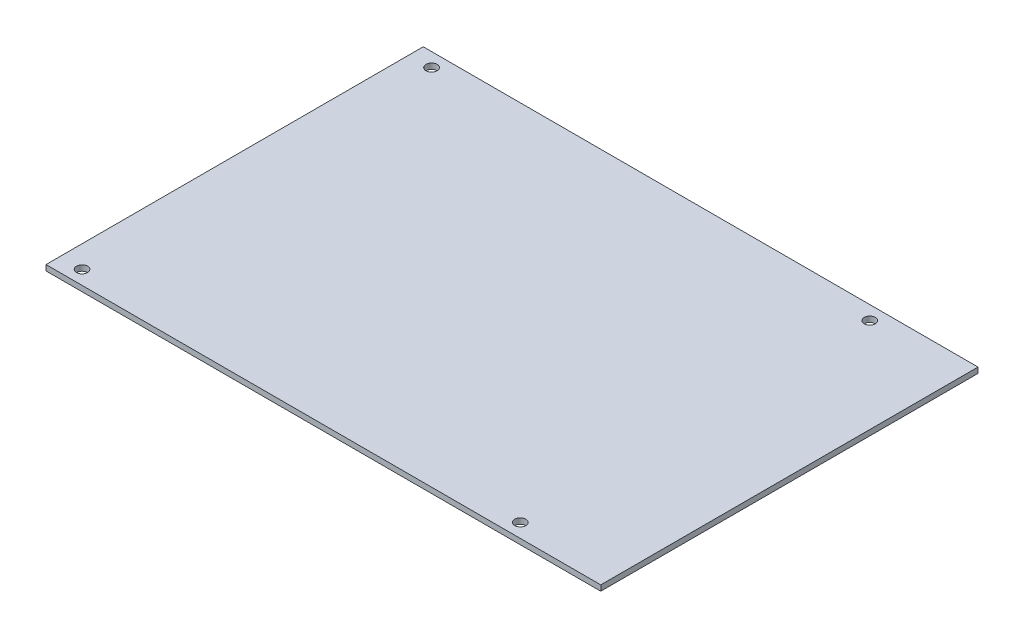
ISO-10303-21;
HEADER;
FILE_DESCRIPTION(('STEP AP214'),'2;1');
FILE_NAME('part.step','',(''),(''),'','','');
FILE_SCHEMA(('AUTOMOTIVE_DESIGN { 1 0 10303 214 1 1 1 1 }'));
ENDSEC;
DATA;
#1=APPLICATION_CONTEXT('core data for automotive mechanical design processes');
#2=APPLICATION_PROTOCOL_DEFINITION('international standard','automotive_design',2000,#1);
#3=PRODUCT_CONTEXT('',#1,'mechanical');
#4=PRODUCT('Part','Part','',(#3));
#5=PRODUCT_RELATED_PRODUCT_CATEGORY('part','',(#4));
#6=PRODUCT_DEFINITION_FORMATION('','',#4);
#7=PRODUCT_DEFINITION_CONTEXT('part definition',#1,'design');
#8=PRODUCT_DEFINITION('design','',#6,#7);
#9=PRODUCT_DEFINITION_SHAPE('','',#8);
#10=(LENGTH_UNIT() NAMED_UNIT(*) SI_UNIT(.MILLI.,.METRE.));
#11=(NAMED_UNIT(*) PLANE_ANGLE_UNIT() SI_UNIT($,.RADIAN.));
#12=(NAMED_UNIT(*) SI_UNIT($,.STERADIAN.) SOLID_ANGLE_UNIT());
#13=UNCERTAINTY_MEASURE_WITH_UNIT(LENGTH_MEASURE(1.E-05),#10,'distance_accuracy_value','');
#14=(GEOMETRIC_REPRESENTATION_CONTEXT(3) GLOBAL_UNCERTAINTY_ASSIGNED_CONTEXT((#13)) GLOBAL_UNIT_ASSIGNED_CONTEXT((#10,
#11,#12)) REPRESENTATION_CONTEXT('',''));
#15=CARTESIAN_POINT('',(0.,0.,0.));
#16=DIRECTION('',(0.,0.,1.));
#17=DIRECTION('',(1.,0.,0.));
#18=AXIS2_PLACEMENT_3D('',#15,#16,#17);
#19=CARTESIAN_POINT('',(-50.,1.,34.));
#20=DIRECTION('',(1.,0.,0.));
#21=DIRECTION('',(0.,0.,-1.));
#22=AXIS2_PLACEMENT_3D('',#19,#20,#21);
#23=PLANE('',#22);
#24=DIRECTION('',(0.,0.,1.));
#25=VECTOR('',#24,1.);
#26=CARTESIAN_POINT('',(-50.,0.,34.));
#27=LINE('',#26,#25);
#28=CARTESIAN_POINT('',(-50.,0.,-34.));
#29=VERTEX_POINT('',#28);
#30=CARTESIAN_POINT('',(-50.,0.,34.));
#31=VERTEX_POINT('',#30);
#32=EDGE_CURVE('E101',#29,#31,#27,.T.);
#33=ORIENTED_EDGE('',*,*,#32,.T.);
#34=DIRECTION('',(0.,-1.,0.));
#35=VECTOR('',#34,1.);
#36=CARTESIAN_POINT('',(-50.,1.,34.));
#37=LINE('',#36,#35);
#38=CARTESIAN_POINT('',(-50.,1.,34.));
#39=VERTEX_POINT('',#38);
#40=EDGE_CURVE('E11',#39,#31,#37,.T.);
#41=ORIENTED_EDGE('',*,*,#40,.F.);
#42=DIRECTION('',(0.,0.,1.));
#43=VECTOR('',#42,1.);
#44=CARTESIAN_POINT('',(-50.,1.,34.));
#45=LINE('',#44,#43);
#46=CARTESIAN_POINT('',(-50.,1.,-34.));
#47=VERTEX_POINT('',#46);
#48=EDGE_CURVE('E88',#47,#39,#45,.T.);
#49=ORIENTED_EDGE('',*,*,#48,.F.);
#50=DIRECTION('',(0.,-1.,0.));
#51=VECTOR('',#50,1.);
#52=CARTESIAN_POINT('',(-50.,1.,-34.));
#53=LINE('',#52,#51);
#54=EDGE_CURVE('E97',#47,#29,#53,.T.);
#55=ORIENTED_EDGE('',*,*,#54,.T.);
#56=EDGE_LOOP('',(#33,#41,#49,#55));
#57=FACE_BOUND('',#56,.T.);
#58=ADVANCED_FACE('F35',(#57),#23,.F.);
#59=CARTESIAN_POINT('',(50.,1.,34.));
#60=DIRECTION('',(0.,0.,-1.));
#61=DIRECTION('',(-1.,0.,0.));
#62=AXIS2_PLACEMENT_3D('',#59,#60,#61);
#63=PLANE('',#62);
#64=DIRECTION('',(1.,0.,0.));
#65=VECTOR('',#64,1.);
#66=CARTESIAN_POINT('',(50.,0.,34.));
#67=LINE('',#66,#65);
#68=CARTESIAN_POINT('',(50.,0.,34.));
#69=VERTEX_POINT('',#68);
#70=EDGE_CURVE('E92',#31,#69,#67,.T.);
#71=ORIENTED_EDGE('',*,*,#70,.T.);
#72=DIRECTION('',(0.,-1.,0.));
#73=VECTOR('',#72,1.);
#74=CARTESIAN_POINT('',(50.,1.,34.));
#75=LINE('',#74,#73);
#76=CARTESIAN_POINT('',(50.,1.,34.));
#77=VERTEX_POINT('',#76);
#78=EDGE_CURVE('E44',#77,#69,#75,.T.);
#79=ORIENTED_EDGE('',*,*,#78,.F.);
#80=DIRECTION('',(1.,0.,0.));
#81=VECTOR('',#80,1.);
#82=CARTESIAN_POINT('',(50.,1.,34.));
#83=LINE('',#82,#81);
#84=EDGE_CURVE('E83',#39,#77,#83,.T.);
#85=ORIENTED_EDGE('',*,*,#84,.F.);
#86=ORIENTED_EDGE('',*,*,#40,.T.);
#87=EDGE_LOOP('',(#71,#79,#85,#86));
#88=FACE_BOUND('',#87,.T.);
#89=ADVANCED_FACE('F91',(#88),#63,.F.);
#90=CARTESIAN_POINT('',(50.,1.,34.));
#91=DIRECTION('',(-1.,0.,0.));
#92=DIRECTION('',(0.,0.,1.));
#93=AXIS2_PLACEMENT_3D('',#90,#91,#92);
#94=PLANE('',#93);
#95=DIRECTION('',(0.,0.,-1.));
#96=VECTOR('',#95,1.);
#97=CARTESIAN_POINT('',(50.,0.,34.));
#98=LINE('',#97,#96);
#99=CARTESIAN_POINT('',(50.,0.,-34.));
#100=VERTEX_POINT('',#99);
#101=EDGE_CURVE('E70',#69,#100,#98,.T.);
#102=ORIENTED_EDGE('',*,*,#101,.T.);
#103=DIRECTION('',(0.,-1.,0.));
#104=VECTOR('',#103,1.);
#105=CARTESIAN_POINT('',(50.,1.,-34.));
#106=LINE('',#105,#104);
#107=CARTESIAN_POINT('',(50.,1.,-34.));
#108=VERTEX_POINT('',#107);
#109=EDGE_CURVE('E93',#108,#100,#106,.T.);
#110=ORIENTED_EDGE('',*,*,#109,.F.);
#111=DIRECTION('',(0.,0.,-1.));
#112=VECTOR('',#111,1.);
#113=CARTESIAN_POINT('',(50.,1.,34.));
#114=LINE('',#113,#112);
#115=EDGE_CURVE('E86',#77,#108,#114,.T.);
#116=ORIENTED_EDGE('',*,*,#115,.F.);
#117=ORIENTED_EDGE('',*,*,#78,.T.);
#118=EDGE_LOOP('',(#102,#110,#116,#117));
#119=FACE_BOUND('',#118,.T.);
#120=ADVANCED_FACE('F95',(#119),#94,.F.);
#121=CARTESIAN_POINT('',(50.,1.,-34.));
#122=DIRECTION('',(0.,0.,1.));
#123=DIRECTION('',(1.,0.,0.));
#124=AXIS2_PLACEMENT_3D('',#121,#122,#123);
#125=PLANE('',#124);
#126=DIRECTION('',(-1.,0.,0.));
#127=VECTOR('',#126,1.);
#128=CARTESIAN_POINT('',(50.,0.,-34.));
#129=LINE('',#128,#127);
#130=EDGE_CURVE('E76',#100,#29,#129,.T.);
#131=ORIENTED_EDGE('',*,*,#130,.T.);
#132=ORIENTED_EDGE('',*,*,#54,.F.);
#133=DIRECTION('',(-1.,0.,0.));
#134=VECTOR('',#133,1.);
#135=CARTESIAN_POINT('',(50.,1.,-34.));
#136=LINE('',#135,#134);
#137=EDGE_CURVE('E53',#108,#47,#136,.T.);
#138=ORIENTED_EDGE('',*,*,#137,.F.);
#139=ORIENTED_EDGE('',*,*,#109,.T.);
#140=EDGE_LOOP('',(#131,#132,#138,#139));
#141=FACE_BOUND('',#140,.T.);
#142=ADVANCED_FACE('F139',(#141),#125,.F.);
#143=CARTESIAN_POINT('',(0.,1.,0.));
#144=DIRECTION('',(0.,1.,0.));
#145=DIRECTION('',(0.,0.,1.));
#146=AXIS2_PLACEMENT_3D('',#143,#144,#145);
#147=PLANE('',#146);
#148=CARTESIAN_POINT('',(-46.,1.,31.5));
#149=DIRECTION('',(0.,1.,0.));
#150=DIRECTION('',(0.,0.,-1.));
#151=AXIS2_PLACEMENT_3D('',#148,#149,#150);
#152=CIRCLE('',#151,0.999999999999998);
#153=CARTESIAN_POINT('',(-46.,1.,30.5));
#154=VERTEX_POINT('',#153);
#155=EDGE_CURVE('E128',#154,#154,#152,.T.);
#156=ORIENTED_EDGE('',*,*,#155,.F.);
#157=EDGE_LOOP('',(#156));
#158=FACE_BOUND('',#157,.T.);
#159=CARTESIAN_POINT('',(33.,1.,-31.5));
#160=DIRECTION('',(0.,1.,0.));
#161=DIRECTION('',(0.,0.,1.));
#162=AXIS2_PLACEMENT_3D('',#159,#160,#161);
#163=CIRCLE('',#162,0.999999999999998);
#164=CARTESIAN_POINT('',(33.,1.,-30.5));
#165=VERTEX_POINT('',#164);
#166=EDGE_CURVE('E118',#165,#165,#163,.T.);
#167=ORIENTED_EDGE('',*,*,#166,.F.);
#168=EDGE_LOOP('',(#167));
#169=FACE_BOUND('',#168,.T.);
#170=CARTESIAN_POINT('',(33.,1.,31.5));
#171=DIRECTION('',(0.,1.,0.));
#172=DIRECTION('',(0.,0.,-1.));
#173=AXIS2_PLACEMENT_3D('',#170,#171,#172);
#174=CIRCLE('',#173,0.999999999999998);
#175=CARTESIAN_POINT('',(33.,1.,30.5));
#176=VERTEX_POINT('',#175);
#177=EDGE_CURVE('E115',#176,#176,#174,.T.);
#178=ORIENTED_EDGE('',*,*,#177,.F.);
#179=EDGE_LOOP('',(#178));
#180=FACE_BOUND('',#179,.T.);
#181=CARTESIAN_POINT('',(-46.,1.,-31.5));
#182=DIRECTION('',(0.,1.,0.));
#183=DIRECTION('',(0.,0.,1.));
#184=AXIS2_PLACEMENT_3D('',#181,#182,#183);
#185=CIRCLE('',#184,0.999999999999998);
#186=CARTESIAN_POINT('',(-46.,1.,-30.5));
#187=VERTEX_POINT('',#186);
#188=EDGE_CURVE('E112',#187,#187,#185,.T.);
#189=ORIENTED_EDGE('',*,*,#188,.F.);
#190=EDGE_LOOP('',(#189));
#191=FACE_BOUND('',#190,.T.);
#192=ORIENTED_EDGE('',*,*,#48,.T.);
#193=ORIENTED_EDGE('',*,*,#84,.T.);
#194=ORIENTED_EDGE('',*,*,#115,.T.);
#195=ORIENTED_EDGE('',*,*,#137,.T.);
#196=EDGE_LOOP('',(#192,#193,#194,#195));
#197=FACE_BOUND('',#196,.T.);
#198=ADVANCED_FACE('F84',(#158,#169,#180,#191,#197),#147,.T.);
#199=CARTESIAN_POINT('',(0.,0.,0.));
#200=DIRECTION('',(0.,1.,0.));
#201=DIRECTION('',(0.,0.,1.));
#202=AXIS2_PLACEMENT_3D('',#199,#200,#201);
#203=PLANE('',#202);
#204=CARTESIAN_POINT('',(-46.,0.,31.5));
#205=DIRECTION('',(0.,1.,0.));
#206=DIRECTION('',(0.,0.,1.));
#207=AXIS2_PLACEMENT_3D('',#204,#205,#206);
#208=CIRCLE('',#207,0.999999999999998);
#209=CARTESIAN_POINT('',(-46.,0.,32.5));
#210=VERTEX_POINT('',#209);
#211=EDGE_CURVE('E38',#210,#210,#208,.T.);
#212=ORIENTED_EDGE('',*,*,#211,.T.);
#213=EDGE_LOOP('',(#212));
#214=FACE_BOUND('',#213,.T.);
#215=CARTESIAN_POINT('',(33.,0.,-31.5));
#216=DIRECTION('',(0.,1.,0.));
#217=DIRECTION('',(0.,0.,1.));
#218=AXIS2_PLACEMENT_3D('',#215,#216,#217);
#219=CIRCLE('',#218,0.999999999999998);
#220=CARTESIAN_POINT('',(33.,0.,-30.5));
#221=VERTEX_POINT('',#220);
#222=EDGE_CURVE('E116',#221,#221,#219,.T.);
#223=ORIENTED_EDGE('',*,*,#222,.T.);
#224=EDGE_LOOP('',(#223));
#225=FACE_BOUND('',#224,.T.);
#226=CARTESIAN_POINT('',(33.,0.,31.5));
#227=DIRECTION('',(0.,1.,0.));
#228=DIRECTION('',(0.,0.,1.));
#229=AXIS2_PLACEMENT_3D('',#226,#227,#228);
#230=CIRCLE('',#229,0.999999999999998);
#231=CARTESIAN_POINT('',(33.,0.,32.5));
#232=VERTEX_POINT('',#231);
#233=EDGE_CURVE('E113',#232,#232,#230,.T.);
#234=ORIENTED_EDGE('',*,*,#233,.T.);
#235=EDGE_LOOP('',(#234));
#236=FACE_BOUND('',#235,.T.);
#237=CARTESIAN_POINT('',(-46.,0.,-31.5));
#238=DIRECTION('',(0.,1.,0.));
#239=DIRECTION('',(0.,0.,1.));
#240=AXIS2_PLACEMENT_3D('',#237,#238,#239);
#241=CIRCLE('',#240,0.999999999999998);
#242=CARTESIAN_POINT('',(-46.,0.,-30.5));
#243=VERTEX_POINT('',#242);
#244=EDGE_CURVE('E104',#243,#243,#241,.T.);
#245=ORIENTED_EDGE('',*,*,#244,.T.);
#246=EDGE_LOOP('',(#245));
#247=FACE_BOUND('',#246,.T.);
#248=ORIENTED_EDGE('',*,*,#32,.F.);
#249=ORIENTED_EDGE('',*,*,#130,.F.);
#250=ORIENTED_EDGE('',*,*,#101,.F.);
#251=ORIENTED_EDGE('',*,*,#70,.F.);
#252=EDGE_LOOP('',(#248,#249,#250,#251));
#253=FACE_BOUND('',#252,.T.);
#254=ADVANCED_FACE('F138',(#214,#225,#236,#247,#253),#203,.F.);
#255=CARTESIAN_POINT('',(-46.,-9.,-31.5));
#256=DIRECTION('',(0.,1.,0.));
#257=DIRECTION('',(0.,0.,1.));
#258=AXIS2_PLACEMENT_3D('',#255,#256,#257);
#259=CYLINDRICAL_SURFACE('',#258,0.999999999999998);
#260=ORIENTED_EDGE('',*,*,#188,.T.);
#261=EDGE_LOOP('',(#260));
#262=FACE_BOUND('',#261,.T.);
#263=ORIENTED_EDGE('',*,*,#244,.F.);
#264=EDGE_LOOP('',(#263));
#265=FACE_BOUND('',#264,.T.);
#266=ADVANCED_FACE('F134',(#262,#265),#259,.F.);
#267=CARTESIAN_POINT('',(33.,-9.,31.5));
#268=DIRECTION('',(0.,1.,0.));
#269=DIRECTION('',(0.,0.,1.));
#270=AXIS2_PLACEMENT_3D('',#267,#268,#269);
#271=CYLINDRICAL_SURFACE('',#270,0.999999999999998);
#272=ORIENTED_EDGE('',*,*,#177,.T.);
#273=EDGE_LOOP('',(#272));
#274=FACE_BOUND('',#273,.T.);
#275=ORIENTED_EDGE('',*,*,#233,.F.);
#276=EDGE_LOOP('',(#275));
#277=FACE_BOUND('',#276,.T.);
#278=ADVANCED_FACE('F188',(#274,#277),#271,.F.);
#279=CARTESIAN_POINT('',(33.,-9.,-31.5));
#280=DIRECTION('',(0.,1.,0.));
#281=DIRECTION('',(0.,0.,1.));
#282=AXIS2_PLACEMENT_3D('',#279,#280,#281);
#283=CYLINDRICAL_SURFACE('',#282,0.999999999999998);
#284=ORIENTED_EDGE('',*,*,#166,.T.);
#285=EDGE_LOOP('',(#284));
#286=FACE_BOUND('',#285,.T.);
#287=ORIENTED_EDGE('',*,*,#222,.F.);
#288=EDGE_LOOP('',(#287));
#289=FACE_BOUND('',#288,.T.);
#290=ADVANCED_FACE('F196',(#286,#289),#283,.F.);
#291=CARTESIAN_POINT('',(-46.,-9.,31.5));
#292=DIRECTION('',(0.,1.,0.));
#293=DIRECTION('',(0.,0.,1.));
#294=AXIS2_PLACEMENT_3D('',#291,#292,#293);
#295=CYLINDRICAL_SURFACE('',#294,0.999999999999998);
#296=ORIENTED_EDGE('',*,*,#155,.T.);
#297=EDGE_LOOP('',(#296));
#298=FACE_BOUND('',#297,.T.);
#299=ORIENTED_EDGE('',*,*,#211,.F.);
#300=EDGE_LOOP('',(#299));
#301=FACE_BOUND('',#300,.T.);
#302=ADVANCED_FACE('F206',(#298,#301),#295,.F.);
#303=CLOSED_SHELL('',(#58,#89,#120,#142,#198,#254,#266,#278,#290,#302));
#304=MANIFOLD_SOLID_BREP('B2',#303);
#305=ADVANCED_BREP_SHAPE_REPRESENTATION('',(#18,#304),#14);
#306=SHAPE_DEFINITION_REPRESENTATION(#9,#305);
ENDSEC;
END-ISO-10303-21;
